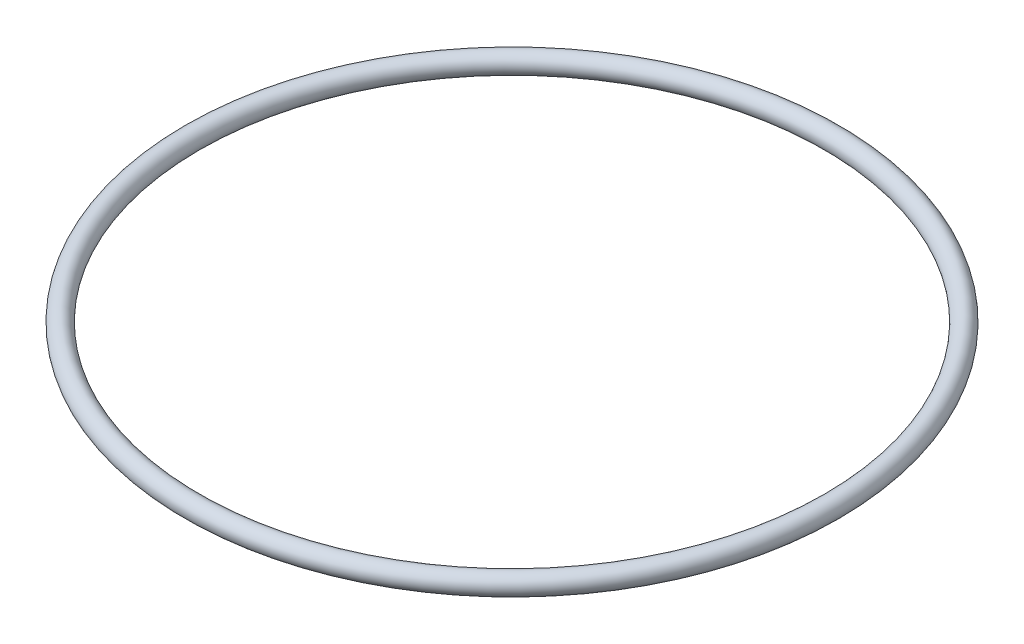
ISO-10303-21;
HEADER;
FILE_DESCRIPTION(('STEP AP214'),'2;1');
FILE_NAME('part.step','',(''),(''),'','','');
FILE_SCHEMA(('AUTOMOTIVE_DESIGN { 1 0 10303 214 1 1 1 1 }'));
ENDSEC;
DATA;
#1=APPLICATION_CONTEXT('core data for automotive mechanical design processes');
#2=APPLICATION_PROTOCOL_DEFINITION('international standard','automotive_design',2000,#1);
#3=PRODUCT_CONTEXT('',#1,'mechanical');
#4=PRODUCT('Part','Part','',(#3));
#5=PRODUCT_RELATED_PRODUCT_CATEGORY('part','',(#4));
#6=PRODUCT_DEFINITION_FORMATION('','',#4);
#7=PRODUCT_DEFINITION_CONTEXT('part definition',#1,'design');
#8=PRODUCT_DEFINITION('design','',#6,#7);
#9=PRODUCT_DEFINITION_SHAPE('','',#8);
#10=(LENGTH_UNIT() NAMED_UNIT(*) SI_UNIT(.MILLI.,.METRE.));
#11=(NAMED_UNIT(*) PLANE_ANGLE_UNIT() SI_UNIT($,.RADIAN.));
#12=(NAMED_UNIT(*) SI_UNIT($,.STERADIAN.) SOLID_ANGLE_UNIT());
#13=UNCERTAINTY_MEASURE_WITH_UNIT(LENGTH_MEASURE(1.E-05),#10,'distance_accuracy_value','');
#14=(GEOMETRIC_REPRESENTATION_CONTEXT(3) GLOBAL_UNCERTAINTY_ASSIGNED_CONTEXT((#13)) GLOBAL_UNIT_ASSIGNED_CONTEXT((#10,
#11,#12)) REPRESENTATION_CONTEXT('',''));
#15=CARTESIAN_POINT('',(0.,0.,0.));
#16=DIRECTION('',(0.,0.,1.));
#17=DIRECTION('',(1.,0.,0.));
#18=AXIS2_PLACEMENT_3D('',#15,#16,#17);
#19=CARTESIAN_POINT('',(0.,0.,0.));
#20=DIRECTION('',(0.,1.,0.));
#21=DIRECTION('',(0.,0.,1.));
#22=AXIS2_PLACEMENT_3D('',#19,#20,#21);
#23=TOROIDAL_SURFACE('',#22,63.66197725,2.);
#24=CARTESIAN_POINT('',(63.66197725,0.,0.));
#25=DIRECTION('',(0.,0.,1.));
#26=DIRECTION('',(1.,0.,0.));
#27=AXIS2_PLACEMENT_3D('',#24,#25,#26);
#28=CIRCLE('',#27,2.);
#29=CARTESIAN_POINT('',(65.66197725,0.,0.));
#30=VERTEX_POINT('',#29);
#31=EDGE_CURVE('E10',#30,#30,#28,.T.);
#32=CARTESIAN_POINT('',(0.,0.,0.));
#33=DIRECTION('',(0.,1.,0.));
#34=DIRECTION('',(0.,0.,1.));
#35=AXIS2_PLACEMENT_3D('',#32,#33,#34);
#36=CIRCLE('',#35,65.66197725);
#37=EDGE_CURVE('',#30,#30,#36,.T.);
#38=ORIENTED_EDGE('',*,*,#31,.F.);
#39=ORIENTED_EDGE('',*,*,#31,.T.);
#40=ORIENTED_EDGE('',*,*,#37,.T.);
#41=ORIENTED_EDGE('',*,*,#37,.F.);
#42=EDGE_LOOP('',(#38,#40,#39,#41));
#43=FACE_BOUND('',#42,.T.);
#44=ADVANCED_FACE('F31',(#43),#23,.T.);
#45=CLOSED_SHELL('',(#44));
#46=MANIFOLD_SOLID_BREP('B2',#45);
#47=ADVANCED_BREP_SHAPE_REPRESENTATION('',(#18,#46),#14);
#48=SHAPE_DEFINITION_REPRESENTATION(#9,#47);
ENDSEC;
END-ISO-10303-21;
